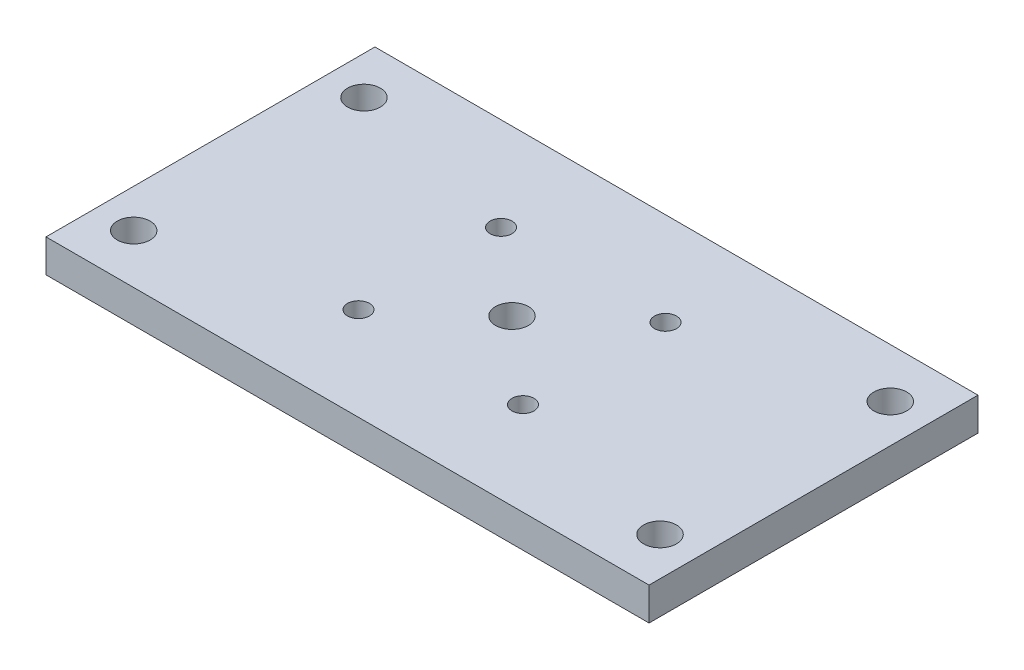
ISO-10303-21;
HEADER;
FILE_DESCRIPTION(('STEP AP214'),'2;1');
FILE_NAME('part.step','',(''),(''),'','','');
FILE_SCHEMA(('AUTOMOTIVE_DESIGN { 1 0 10303 214 1 1 1 1 }'));
ENDSEC;
DATA;
#1=APPLICATION_CONTEXT('core data for automotive mechanical design processes');
#2=APPLICATION_PROTOCOL_DEFINITION('international standard','automotive_design',2000,#1);
#3=PRODUCT_CONTEXT('',#1,'mechanical');
#4=PRODUCT('Part','Part','',(#3));
#5=PRODUCT_RELATED_PRODUCT_CATEGORY('part','',(#4));
#6=PRODUCT_DEFINITION_FORMATION('','',#4);
#7=PRODUCT_DEFINITION_CONTEXT('part definition',#1,'design');
#8=PRODUCT_DEFINITION('design','',#6,#7);
#9=PRODUCT_DEFINITION_SHAPE('','',#8);
#10=(LENGTH_UNIT() NAMED_UNIT(*) SI_UNIT(.MILLI.,.METRE.));
#11=(NAMED_UNIT(*) PLANE_ANGLE_UNIT() SI_UNIT($,.RADIAN.));
#12=(NAMED_UNIT(*) SI_UNIT($,.STERADIAN.) SOLID_ANGLE_UNIT());
#13=UNCERTAINTY_MEASURE_WITH_UNIT(LENGTH_MEASURE(1.E-05),#10,'distance_accuracy_value','');
#14=(GEOMETRIC_REPRESENTATION_CONTEXT(3) GLOBAL_UNCERTAINTY_ASSIGNED_CONTEXT((#13)) GLOBAL_UNIT_ASSIGNED_CONTEXT((#10,
#11,#12)) REPRESENTATION_CONTEXT('',''));
#15=CARTESIAN_POINT('',(0.,0.,0.));
#16=DIRECTION('',(0.,0.,1.));
#17=DIRECTION('',(1.,0.,0.));
#18=AXIS2_PLACEMENT_3D('',#15,#16,#17);
#19=CARTESIAN_POINT('',(0.,3.,0.));
#20=DIRECTION('',(0.,-1.,0.));
#21=DIRECTION('',(0.,0.,-1.));
#22=AXIS2_PLACEMENT_3D('',#19,#20,#21);
#23=PLANE('',#22);
#24=CARTESIAN_POINT('',(-24.,3.,10.5));
#25=DIRECTION('',(0.,1.,0.));
#26=DIRECTION('',(0.,0.,-1.));
#27=AXIS2_PLACEMENT_3D('',#24,#25,#26);
#28=CIRCLE('',#27,1.5);
#29=CARTESIAN_POINT('',(-24.,3.,8.99999999999998));
#30=VERTEX_POINT('',#29);
#31=EDGE_CURVE('E151',#30,#30,#28,.T.);
#32=ORIENTED_EDGE('',*,*,#31,.F.);
#33=EDGE_LOOP('',(#32));
#34=FACE_BOUND('',#33,.T.);
#35=CARTESIAN_POINT('',(7.5,3.,6.5));
#36=DIRECTION('',(0.,1.,0.));
#37=DIRECTION('',(0.,0.,1.));
#38=AXIS2_PLACEMENT_3D('',#35,#36,#37);
#39=CIRCLE('',#38,1.);
#40=CARTESIAN_POINT('',(7.5,3.,7.5));
#41=VERTEX_POINT('',#40);
#42=EDGE_CURVE('E139',#41,#41,#39,.T.);
#43=ORIENTED_EDGE('',*,*,#42,.F.);
#44=EDGE_LOOP('',(#43));
#45=FACE_BOUND('',#44,.T.);
#46=CARTESIAN_POINT('',(24.,3.,-10.5));
#47=DIRECTION('',(0.,1.,0.));
#48=DIRECTION('',(0.,0.,-1.));
#49=AXIS2_PLACEMENT_3D('',#46,#47,#48);
#50=CIRCLE('',#49,1.5);
#51=CARTESIAN_POINT('',(24.,3.,-12.));
#52=VERTEX_POINT('',#51);
#53=EDGE_CURVE('E127',#52,#52,#50,.T.);
#54=ORIENTED_EDGE('',*,*,#53,.F.);
#55=EDGE_LOOP('',(#54));
#56=FACE_BOUND('',#55,.T.);
#57=CARTESIAN_POINT('',(-7.5,3.,-6.5));
#58=DIRECTION('',(0.,1.,0.));
#59=DIRECTION('',(0.,0.,1.));
#60=AXIS2_PLACEMENT_3D('',#57,#58,#59);
#61=CIRCLE('',#60,1.);
#62=CARTESIAN_POINT('',(-7.5,3.,-5.5));
#63=VERTEX_POINT('',#62);
#64=EDGE_CURVE('E115',#63,#63,#61,.T.);
#65=ORIENTED_EDGE('',*,*,#64,.F.);
#66=EDGE_LOOP('',(#65));
#67=FACE_BOUND('',#66,.T.);
#68=DIRECTION('',(0.,0.,-1.));
#69=VECTOR('',#68,1.);
#70=CARTESIAN_POINT('',(27.5,3.,15.));
#71=LINE('',#70,#69);
#72=CARTESIAN_POINT('',(27.5,3.,15.));
#73=VERTEX_POINT('',#72);
#74=CARTESIAN_POINT('',(27.5,3.,-15.));
#75=VERTEX_POINT('',#74);
#76=EDGE_CURVE('E85',#73,#75,#71,.T.);
#77=ORIENTED_EDGE('',*,*,#76,.T.);
#78=DIRECTION('',(-1.,0.,0.));
#79=VECTOR('',#78,1.);
#80=CARTESIAN_POINT('',(-27.5,3.,-15.));
#81=LINE('',#80,#79);
#82=CARTESIAN_POINT('',(-27.5,3.,-15.));
#83=VERTEX_POINT('',#82);
#84=EDGE_CURVE('E80',#75,#83,#81,.T.);
#85=ORIENTED_EDGE('',*,*,#84,.T.);
#86=DIRECTION('',(0.,0.,1.));
#87=VECTOR('',#86,1.);
#88=CARTESIAN_POINT('',(-27.5,3.,15.));
#89=LINE('',#88,#87);
#90=CARTESIAN_POINT('',(-27.5,3.,15.));
#91=VERTEX_POINT('',#90);
#92=EDGE_CURVE('E83',#83,#91,#89,.T.);
#93=ORIENTED_EDGE('',*,*,#92,.T.);
#94=DIRECTION('',(1.,0.,0.));
#95=VECTOR('',#94,1.);
#96=CARTESIAN_POINT('',(-27.5,3.,15.));
#97=LINE('',#96,#95);
#98=EDGE_CURVE('E50',#91,#73,#97,.T.);
#99=ORIENTED_EDGE('',*,*,#98,.T.);
#100=EDGE_LOOP('',(#77,#85,#93,#99));
#101=FACE_BOUND('',#100,.T.);
#102=CARTESIAN_POINT('',(0.,3.,0.));
#103=DIRECTION('',(0.,1.,0.));
#104=DIRECTION('',(0.,0.,1.));
#105=AXIS2_PLACEMENT_3D('',#102,#103,#104);
#106=CIRCLE('',#105,1.5);
#107=CARTESIAN_POINT('',(0.,3.,1.5));
#108=VERTEX_POINT('',#107);
#109=EDGE_CURVE('E100',#108,#108,#106,.T.);
#110=ORIENTED_EDGE('',*,*,#109,.F.);
#111=EDGE_LOOP('',(#110));
#112=FACE_BOUND('',#111,.T.);
#113=CARTESIAN_POINT('',(-24.,3.,-10.5));
#114=DIRECTION('',(0.,1.,0.));
#115=DIRECTION('',(0.,0.,1.));
#116=AXIS2_PLACEMENT_3D('',#113,#114,#115);
#117=CIRCLE('',#116,1.5);
#118=CARTESIAN_POINT('',(-24.,3.,-9.));
#119=VERTEX_POINT('',#118);
#120=EDGE_CURVE('E121',#119,#119,#117,.T.);
#121=ORIENTED_EDGE('',*,*,#120,.F.);
#122=EDGE_LOOP('',(#121));
#123=FACE_BOUND('',#122,.T.);
#124=CARTESIAN_POINT('',(7.5,3.,-6.5));
#125=DIRECTION('',(0.,1.,0.));
#126=DIRECTION('',(0.,0.,-1.));
#127=AXIS2_PLACEMENT_3D('',#124,#125,#126);
#128=CIRCLE('',#127,1.);
#129=CARTESIAN_POINT('',(7.5,3.,-7.5));
#130=VERTEX_POINT('',#129);
#131=EDGE_CURVE('E133',#130,#130,#128,.T.);
#132=ORIENTED_EDGE('',*,*,#131,.F.);
#133=EDGE_LOOP('',(#132));
#134=FACE_BOUND('',#133,.T.);
#135=CARTESIAN_POINT('',(24.,3.,10.5));
#136=DIRECTION('',(0.,1.,0.));
#137=DIRECTION('',(0.,0.,1.));
#138=AXIS2_PLACEMENT_3D('',#135,#136,#137);
#139=CIRCLE('',#138,1.5);
#140=CARTESIAN_POINT('',(24.,3.,12.));
#141=VERTEX_POINT('',#140);
#142=EDGE_CURVE('E145',#141,#141,#139,.T.);
#143=ORIENTED_EDGE('',*,*,#142,.F.);
#144=EDGE_LOOP('',(#143));
#145=FACE_BOUND('',#144,.T.);
#146=CARTESIAN_POINT('',(-7.5,3.,6.5));
#147=DIRECTION('',(0.,1.,0.));
#148=DIRECTION('',(0.,0.,-1.));
#149=AXIS2_PLACEMENT_3D('',#146,#147,#148);
#150=CIRCLE('',#149,1.);
#151=CARTESIAN_POINT('',(-7.5,3.,5.5));
#152=VERTEX_POINT('',#151);
#153=EDGE_CURVE('E157',#152,#152,#150,.T.);
#154=ORIENTED_EDGE('',*,*,#153,.F.);
#155=EDGE_LOOP('',(#154));
#156=FACE_BOUND('',#155,.T.);
#157=ADVANCED_FACE('F33',(#34,#45,#56,#67,#101,#112,#123,#134,#145,#156),#23,.F.);
#158=CARTESIAN_POINT('',(0.,0.,0.));
#159=DIRECTION('',(0.,-1.,0.));
#160=DIRECTION('',(0.,0.,-1.));
#161=AXIS2_PLACEMENT_3D('',#158,#159,#160);
#162=PLANE('',#161);
#163=CARTESIAN_POINT('',(-24.,0.,10.5));
#164=DIRECTION('',(0.,1.,0.));
#165=DIRECTION('',(0.,0.,-1.));
#166=AXIS2_PLACEMENT_3D('',#163,#164,#165);
#167=CIRCLE('',#166,1.5);
#168=CARTESIAN_POINT('',(-24.,0.,8.99999999999998));
#169=VERTEX_POINT('',#168);
#170=EDGE_CURVE('E154',#169,#169,#167,.T.);
#171=ORIENTED_EDGE('',*,*,#170,.T.);
#172=EDGE_LOOP('',(#171));
#173=FACE_BOUND('',#172,.T.);
#174=CARTESIAN_POINT('',(7.5,0.,6.5));
#175=DIRECTION('',(0.,1.,0.));
#176=DIRECTION('',(0.,0.,1.));
#177=AXIS2_PLACEMENT_3D('',#174,#175,#176);
#178=CIRCLE('',#177,1.);
#179=CARTESIAN_POINT('',(7.5,0.,7.5));
#180=VERTEX_POINT('',#179);
#181=EDGE_CURVE('E142',#180,#180,#178,.T.);
#182=ORIENTED_EDGE('',*,*,#181,.T.);
#183=EDGE_LOOP('',(#182));
#184=FACE_BOUND('',#183,.T.);
#185=CARTESIAN_POINT('',(24.,0.,-10.5));
#186=DIRECTION('',(0.,1.,0.));
#187=DIRECTION('',(0.,0.,-1.));
#188=AXIS2_PLACEMENT_3D('',#185,#186,#187);
#189=CIRCLE('',#188,1.5);
#190=CARTESIAN_POINT('',(24.,0.,-12.));
#191=VERTEX_POINT('',#190);
#192=EDGE_CURVE('E130',#191,#191,#189,.T.);
#193=ORIENTED_EDGE('',*,*,#192,.T.);
#194=EDGE_LOOP('',(#193));
#195=FACE_BOUND('',#194,.T.);
#196=CARTESIAN_POINT('',(-7.5,0.,-6.5));
#197=DIRECTION('',(0.,1.,0.));
#198=DIRECTION('',(0.,0.,1.));
#199=AXIS2_PLACEMENT_3D('',#196,#197,#198);
#200=CIRCLE('',#199,1.);
#201=CARTESIAN_POINT('',(-7.5,0.,-5.5));
#202=VERTEX_POINT('',#201);
#203=EDGE_CURVE('E118',#202,#202,#200,.T.);
#204=ORIENTED_EDGE('',*,*,#203,.T.);
#205=EDGE_LOOP('',(#204));
#206=FACE_BOUND('',#205,.T.);
#207=DIRECTION('',(0.,0.,-1.));
#208=VECTOR('',#207,1.);
#209=CARTESIAN_POINT('',(27.5,0.,15.));
#210=LINE('',#209,#208);
#211=CARTESIAN_POINT('',(27.5,0.,15.));
#212=VERTEX_POINT('',#211);
#213=CARTESIAN_POINT('',(27.5,0.,-15.));
#214=VERTEX_POINT('',#213);
#215=EDGE_CURVE('E97',#212,#214,#210,.T.);
#216=ORIENTED_EDGE('',*,*,#215,.F.);
#217=DIRECTION('',(1.,0.,0.));
#218=VECTOR('',#217,1.);
#219=CARTESIAN_POINT('',(-27.5,0.,15.));
#220=LINE('',#219,#218);
#221=CARTESIAN_POINT('',(-27.5,0.,15.));
#222=VERTEX_POINT('',#221);
#223=EDGE_CURVE('E73',#222,#212,#220,.T.);
#224=ORIENTED_EDGE('',*,*,#223,.F.);
#225=DIRECTION('',(0.,0.,1.));
#226=VECTOR('',#225,1.);
#227=CARTESIAN_POINT('',(-27.5,0.,15.));
#228=LINE('',#227,#226);
#229=CARTESIAN_POINT('',(-27.5,0.,-15.));
#230=VERTEX_POINT('',#229);
#231=EDGE_CURVE('E67',#230,#222,#228,.T.);
#232=ORIENTED_EDGE('',*,*,#231,.F.);
#233=DIRECTION('',(-1.,0.,0.));
#234=VECTOR('',#233,1.);
#235=CARTESIAN_POINT('',(-27.5,0.,-15.));
#236=LINE('',#235,#234);
#237=EDGE_CURVE('E89',#214,#230,#236,.T.);
#238=ORIENTED_EDGE('',*,*,#237,.F.);
#239=EDGE_LOOP('',(#216,#224,#232,#238));
#240=FACE_BOUND('',#239,.T.);
#241=CARTESIAN_POINT('',(0.,0.,0.));
#242=DIRECTION('',(0.,1.,0.));
#243=DIRECTION('',(0.,0.,1.));
#244=AXIS2_PLACEMENT_3D('',#241,#242,#243);
#245=CIRCLE('',#244,1.5);
#246=CARTESIAN_POINT('',(0.,0.,1.5));
#247=VERTEX_POINT('',#246);
#248=EDGE_CURVE('E112',#247,#247,#245,.T.);
#249=ORIENTED_EDGE('',*,*,#248,.T.);
#250=EDGE_LOOP('',(#249));
#251=FACE_BOUND('',#250,.T.);
#252=CARTESIAN_POINT('',(-24.,0.,-10.5));
#253=DIRECTION('',(0.,1.,0.));
#254=DIRECTION('',(0.,0.,1.));
#255=AXIS2_PLACEMENT_3D('',#252,#253,#254);
#256=CIRCLE('',#255,1.5);
#257=CARTESIAN_POINT('',(-24.,0.,-9.));
#258=VERTEX_POINT('',#257);
#259=EDGE_CURVE('E124',#258,#258,#256,.T.);
#260=ORIENTED_EDGE('',*,*,#259,.T.);
#261=EDGE_LOOP('',(#260));
#262=FACE_BOUND('',#261,.T.);
#263=CARTESIAN_POINT('',(7.5,0.,-6.5));
#264=DIRECTION('',(0.,1.,0.));
#265=DIRECTION('',(0.,0.,-1.));
#266=AXIS2_PLACEMENT_3D('',#263,#264,#265);
#267=CIRCLE('',#266,1.);
#268=CARTESIAN_POINT('',(7.5,0.,-7.5));
#269=VERTEX_POINT('',#268);
#270=EDGE_CURVE('E136',#269,#269,#267,.T.);
#271=ORIENTED_EDGE('',*,*,#270,.T.);
#272=EDGE_LOOP('',(#271));
#273=FACE_BOUND('',#272,.T.);
#274=CARTESIAN_POINT('',(24.,0.,10.5));
#275=DIRECTION('',(0.,1.,0.));
#276=DIRECTION('',(0.,0.,1.));
#277=AXIS2_PLACEMENT_3D('',#274,#275,#276);
#278=CIRCLE('',#277,1.5);
#279=CARTESIAN_POINT('',(24.,0.,12.));
#280=VERTEX_POINT('',#279);
#281=EDGE_CURVE('E148',#280,#280,#278,.T.);
#282=ORIENTED_EDGE('',*,*,#281,.T.);
#283=EDGE_LOOP('',(#282));
#284=FACE_BOUND('',#283,.T.);
#285=CARTESIAN_POINT('',(-7.5,0.,6.5));
#286=DIRECTION('',(0.,1.,0.));
#287=DIRECTION('',(0.,0.,-1.));
#288=AXIS2_PLACEMENT_3D('',#285,#286,#287);
#289=CIRCLE('',#288,1.);
#290=CARTESIAN_POINT('',(-7.5,0.,5.5));
#291=VERTEX_POINT('',#290);
#292=EDGE_CURVE('E160',#291,#291,#289,.T.);
#293=ORIENTED_EDGE('',*,*,#292,.T.);
#294=EDGE_LOOP('',(#293));
#295=FACE_BOUND('',#294,.T.);
#296=ADVANCED_FACE('F108',(#173,#184,#195,#206,#240,#251,#262,#273,#284,#295),#162,.T.);
#297=CARTESIAN_POINT('',(27.5,3.,15.));
#298=DIRECTION('',(-1.,0.,0.));
#299=DIRECTION('',(0.,0.,1.));
#300=AXIS2_PLACEMENT_3D('',#297,#298,#299);
#301=PLANE('',#300);
#302=ORIENTED_EDGE('',*,*,#215,.T.);
#303=DIRECTION('',(0.,-1.,0.));
#304=VECTOR('',#303,1.);
#305=CARTESIAN_POINT('',(27.5,3.,-15.));
#306=LINE('',#305,#304);
#307=EDGE_CURVE('E11',#75,#214,#306,.T.);
#308=ORIENTED_EDGE('',*,*,#307,.F.);
#309=ORIENTED_EDGE('',*,*,#76,.F.);
#310=DIRECTION('',(0.,-1.,0.));
#311=VECTOR('',#310,1.);
#312=CARTESIAN_POINT('',(27.5,3.,15.));
#313=LINE('',#312,#311);
#314=EDGE_CURVE('E93',#73,#212,#313,.T.);
#315=ORIENTED_EDGE('',*,*,#314,.T.);
#316=EDGE_LOOP('',(#302,#308,#309,#315));
#317=FACE_BOUND('',#316,.T.);
#318=ADVANCED_FACE('F35',(#317),#301,.F.);
#319=CARTESIAN_POINT('',(-27.5,3.,-15.));
#320=DIRECTION('',(0.,0.,1.));
#321=DIRECTION('',(1.,0.,0.));
#322=AXIS2_PLACEMENT_3D('',#319,#320,#321);
#323=PLANE('',#322);
#324=ORIENTED_EDGE('',*,*,#237,.T.);
#325=DIRECTION('',(0.,-1.,0.));
#326=VECTOR('',#325,1.);
#327=CARTESIAN_POINT('',(-27.5,3.,-15.));
#328=LINE('',#327,#326);
#329=EDGE_CURVE('E42',#83,#230,#328,.T.);
#330=ORIENTED_EDGE('',*,*,#329,.F.);
#331=ORIENTED_EDGE('',*,*,#84,.F.);
#332=ORIENTED_EDGE('',*,*,#307,.T.);
#333=EDGE_LOOP('',(#324,#330,#331,#332));
#334=FACE_BOUND('',#333,.T.);
#335=ADVANCED_FACE('F88',(#334),#323,.F.);
#336=CARTESIAN_POINT('',(-27.5,3.,15.));
#337=DIRECTION('',(1.,0.,0.));
#338=DIRECTION('',(0.,0.,-1.));
#339=AXIS2_PLACEMENT_3D('',#336,#337,#338);
#340=PLANE('',#339);
#341=ORIENTED_EDGE('',*,*,#231,.T.);
#342=DIRECTION('',(0.,-1.,0.));
#343=VECTOR('',#342,1.);
#344=CARTESIAN_POINT('',(-27.5,3.,15.));
#345=LINE('',#344,#343);
#346=EDGE_CURVE('E90',#91,#222,#345,.T.);
#347=ORIENTED_EDGE('',*,*,#346,.F.);
#348=ORIENTED_EDGE('',*,*,#92,.F.);
#349=ORIENTED_EDGE('',*,*,#329,.T.);
#350=EDGE_LOOP('',(#341,#347,#348,#349));
#351=FACE_BOUND('',#350,.T.);
#352=ADVANCED_FACE('F91',(#351),#340,.F.);
#353=CARTESIAN_POINT('',(-27.5,3.,15.));
#354=DIRECTION('',(0.,0.,-1.));
#355=DIRECTION('',(-1.,0.,0.));
#356=AXIS2_PLACEMENT_3D('',#353,#354,#355);
#357=PLANE('',#356);
#358=ORIENTED_EDGE('',*,*,#223,.T.);
#359=ORIENTED_EDGE('',*,*,#314,.F.);
#360=ORIENTED_EDGE('',*,*,#98,.F.);
#361=ORIENTED_EDGE('',*,*,#346,.T.);
#362=EDGE_LOOP('',(#358,#359,#360,#361));
#363=FACE_BOUND('',#362,.T.);
#364=ADVANCED_FACE('F105',(#363),#357,.F.);
#365=CARTESIAN_POINT('',(0.,3.,0.));
#366=DIRECTION('',(0.,-1.,0.));
#367=DIRECTION('',(0.,0.,-1.));
#368=AXIS2_PLACEMENT_3D('',#365,#366,#367);
#369=CYLINDRICAL_SURFACE('',#368,1.5);
#370=ORIENTED_EDGE('',*,*,#109,.T.);
#371=EDGE_LOOP('',(#370));
#372=FACE_BOUND('',#371,.T.);
#373=ORIENTED_EDGE('',*,*,#248,.F.);
#374=EDGE_LOOP('',(#373));
#375=FACE_BOUND('',#374,.T.);
#376=ADVANCED_FACE('F180',(#372,#375),#369,.F.);
#377=CARTESIAN_POINT('',(-7.5,3.,-6.5));
#378=DIRECTION('',(0.,-1.,0.));
#379=DIRECTION('',(0.,0.,-1.));
#380=AXIS2_PLACEMENT_3D('',#377,#378,#379);
#381=CYLINDRICAL_SURFACE('',#380,1.);
#382=ORIENTED_EDGE('',*,*,#64,.T.);
#383=EDGE_LOOP('',(#382));
#384=FACE_BOUND('',#383,.T.);
#385=ORIENTED_EDGE('',*,*,#203,.F.);
#386=EDGE_LOOP('',(#385));
#387=FACE_BOUND('',#386,.T.);
#388=ADVANCED_FACE('F226',(#384,#387),#381,.F.);
#389=CARTESIAN_POINT('',(-24.,3.,-10.5));
#390=DIRECTION('',(0.,-1.,0.));
#391=DIRECTION('',(0.,0.,-1.));
#392=AXIS2_PLACEMENT_3D('',#389,#390,#391);
#393=CYLINDRICAL_SURFACE('',#392,1.5);
#394=ORIENTED_EDGE('',*,*,#120,.T.);
#395=EDGE_LOOP('',(#394));
#396=FACE_BOUND('',#395,.T.);
#397=ORIENTED_EDGE('',*,*,#259,.F.);
#398=EDGE_LOOP('',(#397));
#399=FACE_BOUND('',#398,.T.);
#400=ADVANCED_FACE('F234',(#396,#399),#393,.F.);
#401=CARTESIAN_POINT('',(24.,3.,-10.5));
#402=DIRECTION('',(0.,-1.,0.));
#403=DIRECTION('',(0.,0.,-1.));
#404=AXIS2_PLACEMENT_3D('',#401,#402,#403);
#405=CYLINDRICAL_SURFACE('',#404,1.5);
#406=ORIENTED_EDGE('',*,*,#53,.T.);
#407=EDGE_LOOP('',(#406));
#408=FACE_BOUND('',#407,.T.);
#409=ORIENTED_EDGE('',*,*,#192,.F.);
#410=EDGE_LOOP('',(#409));
#411=FACE_BOUND('',#410,.T.);
#412=ADVANCED_FACE('F242',(#408,#411),#405,.F.);
#413=CARTESIAN_POINT('',(7.5,3.,-6.5));
#414=DIRECTION('',(0.,-1.,0.));
#415=DIRECTION('',(0.,0.,-1.));
#416=AXIS2_PLACEMENT_3D('',#413,#414,#415);
#417=CYLINDRICAL_SURFACE('',#416,1.);
#418=ORIENTED_EDGE('',*,*,#131,.T.);
#419=EDGE_LOOP('',(#418));
#420=FACE_BOUND('',#419,.T.);
#421=ORIENTED_EDGE('',*,*,#270,.F.);
#422=EDGE_LOOP('',(#421));
#423=FACE_BOUND('',#422,.T.);
#424=ADVANCED_FACE('F251',(#420,#423),#417,.F.);
#425=CARTESIAN_POINT('',(7.5,3.,6.5));
#426=DIRECTION('',(0.,-1.,0.));
#427=DIRECTION('',(0.,0.,-1.));
#428=AXIS2_PLACEMENT_3D('',#425,#426,#427);
#429=CYLINDRICAL_SURFACE('',#428,1.);
#430=ORIENTED_EDGE('',*,*,#42,.T.);
#431=EDGE_LOOP('',(#430));
#432=FACE_BOUND('',#431,.T.);
#433=ORIENTED_EDGE('',*,*,#181,.F.);
#434=EDGE_LOOP('',(#433));
#435=FACE_BOUND('',#434,.T.);
#436=ADVANCED_FACE('F260',(#432,#435),#429,.F.);
#437=CARTESIAN_POINT('',(24.,3.,10.5));
#438=DIRECTION('',(0.,-1.,0.));
#439=DIRECTION('',(0.,0.,-1.));
#440=AXIS2_PLACEMENT_3D('',#437,#438,#439);
#441=CYLINDRICAL_SURFACE('',#440,1.5);
#442=ORIENTED_EDGE('',*,*,#142,.T.);
#443=EDGE_LOOP('',(#442));
#444=FACE_BOUND('',#443,.T.);
#445=ORIENTED_EDGE('',*,*,#281,.F.);
#446=EDGE_LOOP('',(#445));
#447=FACE_BOUND('',#446,.T.);
#448=ADVANCED_FACE('F269',(#444,#447),#441,.F.);
#449=CARTESIAN_POINT('',(-24.,3.,10.5));
#450=DIRECTION('',(0.,-1.,0.));
#451=DIRECTION('',(0.,0.,-1.));
#452=AXIS2_PLACEMENT_3D('',#449,#450,#451);
#453=CYLINDRICAL_SURFACE('',#452,1.5);
#454=ORIENTED_EDGE('',*,*,#31,.T.);
#455=EDGE_LOOP('',(#454));
#456=FACE_BOUND('',#455,.T.);
#457=ORIENTED_EDGE('',*,*,#170,.F.);
#458=EDGE_LOOP('',(#457));
#459=FACE_BOUND('',#458,.T.);
#460=ADVANCED_FACE('F278',(#456,#459),#453,.F.);
#461=CARTESIAN_POINT('',(-7.5,3.,6.5));
#462=DIRECTION('',(0.,-1.,0.));
#463=DIRECTION('',(0.,0.,-1.));
#464=AXIS2_PLACEMENT_3D('',#461,#462,#463);
#465=CYLINDRICAL_SURFACE('',#464,1.);
#466=ORIENTED_EDGE('',*,*,#153,.T.);
#467=EDGE_LOOP('',(#466));
#468=FACE_BOUND('',#467,.T.);
#469=ORIENTED_EDGE('',*,*,#292,.F.);
#470=EDGE_LOOP('',(#469));
#471=FACE_BOUND('',#470,.T.);
#472=ADVANCED_FACE('F166',(#468,#471),#465,.F.);
#473=CLOSED_SHELL('',(#157,#296,#318,#335,#352,#364,#376,#388,#400,#412,#424,#436,#448,#460,#472));
#474=MANIFOLD_SOLID_BREP('B2',#473);
#475=ADVANCED_BREP_SHAPE_REPRESENTATION('',(#18,#474),#14);
#476=SHAPE_DEFINITION_REPRESENTATION(#9,#475);
ENDSEC;
END-ISO-10303-21;
